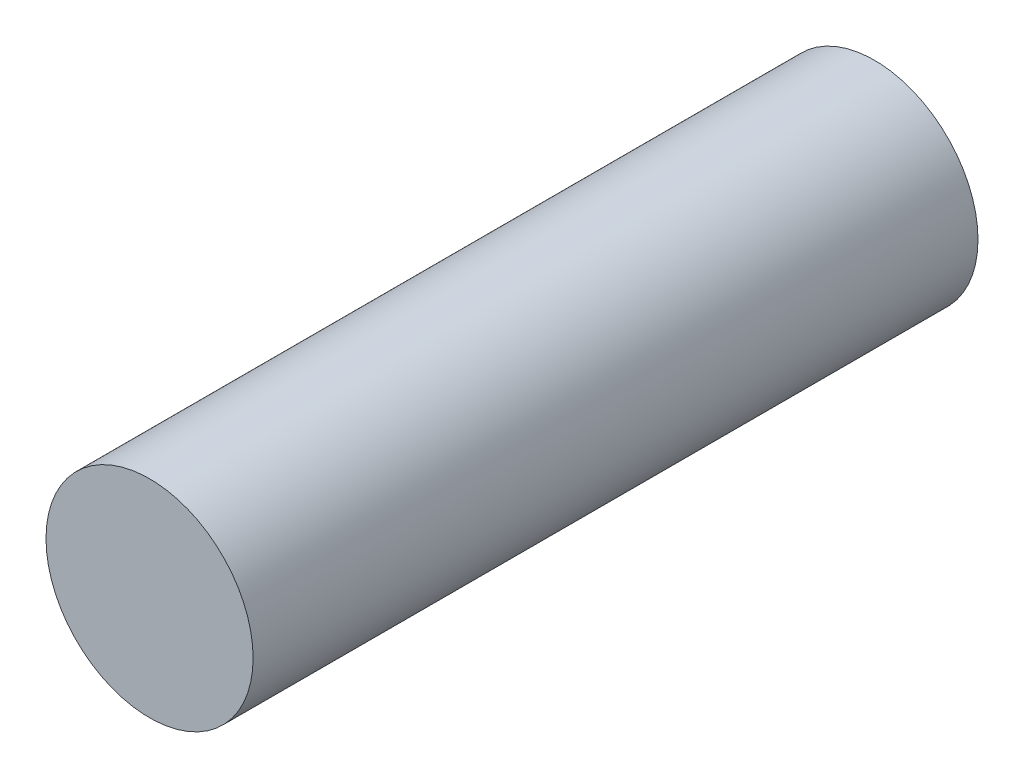
ISO-10303-21;
HEADER;
FILE_DESCRIPTION(('STEP AP214'),'2;1');
FILE_NAME('part.step','',(''),(''),'','','');
FILE_SCHEMA(('AUTOMOTIVE_DESIGN { 1 0 10303 214 1 1 1 1 }'));
ENDSEC;
DATA;
#1=APPLICATION_CONTEXT('core data for automotive mechanical design processes');
#2=APPLICATION_PROTOCOL_DEFINITION('international standard','automotive_design',2000,#1);
#3=PRODUCT_CONTEXT('',#1,'mechanical');
#4=PRODUCT('Part','Part','',(#3));
#5=PRODUCT_RELATED_PRODUCT_CATEGORY('part','',(#4));
#6=PRODUCT_DEFINITION_FORMATION('','',#4);
#7=PRODUCT_DEFINITION_CONTEXT('part definition',#1,'design');
#8=PRODUCT_DEFINITION('design','',#6,#7);
#9=PRODUCT_DEFINITION_SHAPE('','',#8);
#10=(LENGTH_UNIT() NAMED_UNIT(*) SI_UNIT(.MILLI.,.METRE.));
#11=(NAMED_UNIT(*) PLANE_ANGLE_UNIT() SI_UNIT($,.RADIAN.));
#12=(NAMED_UNIT(*) SI_UNIT($,.STERADIAN.) SOLID_ANGLE_UNIT());
#13=UNCERTAINTY_MEASURE_WITH_UNIT(LENGTH_MEASURE(1.E-05),#10,'distance_accuracy_value','');
#14=(GEOMETRIC_REPRESENTATION_CONTEXT(3) GLOBAL_UNCERTAINTY_ASSIGNED_CONTEXT((#13)) GLOBAL_UNIT_ASSIGNED_CONTEXT((#10,
#11,#12)) REPRESENTATION_CONTEXT('',''));
#15=CARTESIAN_POINT('',(0.,0.,0.));
#16=DIRECTION('',(0.,0.,1.));
#17=DIRECTION('',(1.,0.,0.));
#18=AXIS2_PLACEMENT_3D('',#15,#16,#17);
#19=CARTESIAN_POINT('',(0.,0.,133.35));
#20=DIRECTION('',(0.,0.,-1.));
#21=DIRECTION('',(-1.,0.,0.));
#22=AXIS2_PLACEMENT_3D('',#19,#20,#21);
#23=CYLINDRICAL_SURFACE('',#22,38.1);
#24=CARTESIAN_POINT('',(0.,0.,133.35));
#25=DIRECTION('',(0.,0.,1.));
#26=DIRECTION('',(1.,0.,0.));
#27=AXIS2_PLACEMENT_3D('',#24,#25,#26);
#28=CIRCLE('',#27,38.1);
#29=CARTESIAN_POINT('',(38.1,0.,133.35));
#30=VERTEX_POINT('',#29);
#31=EDGE_CURVE('E10',#30,#30,#28,.T.);
#32=ORIENTED_EDGE('',*,*,#31,.F.);
#33=EDGE_LOOP('',(#32));
#34=FACE_BOUND('',#33,.T.);
#35=CARTESIAN_POINT('',(0.,0.,-133.35));
#36=DIRECTION('',(0.,0.,1.));
#37=DIRECTION('',(1.,0.,0.));
#38=AXIS2_PLACEMENT_3D('',#35,#36,#37);
#39=CIRCLE('',#38,38.1);
#40=CARTESIAN_POINT('',(38.1,0.,-133.35));
#41=VERTEX_POINT('',#40);
#42=EDGE_CURVE('E40',#41,#41,#39,.T.);
#43=ORIENTED_EDGE('',*,*,#42,.T.);
#44=EDGE_LOOP('',(#43));
#45=FACE_BOUND('',#44,.T.);
#46=ADVANCED_FACE('F37',(#34,#45),#23,.T.);
#47=CARTESIAN_POINT('',(0.,0.,133.35));
#48=DIRECTION('',(0.,0.,1.));
#49=DIRECTION('',(1.,0.,0.));
#50=AXIS2_PLACEMENT_3D('',#47,#48,#49);
#51=PLANE('',#50);
#52=ORIENTED_EDGE('',*,*,#31,.T.);
#53=EDGE_LOOP('',(#52));
#54=FACE_BOUND('',#53,.T.);
#55=ADVANCED_FACE('F54',(#54),#51,.T.);
#56=CARTESIAN_POINT('',(0.,0.,-133.35));
#57=DIRECTION('',(0.,0.,1.));
#58=DIRECTION('',(1.,0.,0.));
#59=AXIS2_PLACEMENT_3D('',#56,#57,#58);
#60=PLANE('',#59);
#61=ORIENTED_EDGE('',*,*,#42,.F.);
#62=EDGE_LOOP('',(#61));
#63=FACE_BOUND('',#62,.T.);
#64=ADVANCED_FACE('F52',(#63),#60,.F.);
#65=CLOSED_SHELL('',(#46,#55,#64));
#66=MANIFOLD_SOLID_BREP('B2',#65);
#67=ADVANCED_BREP_SHAPE_REPRESENTATION('',(#18,#66),#14);
#68=SHAPE_DEFINITION_REPRESENTATION(#9,#67);
ENDSEC;
END-ISO-10303-21;
